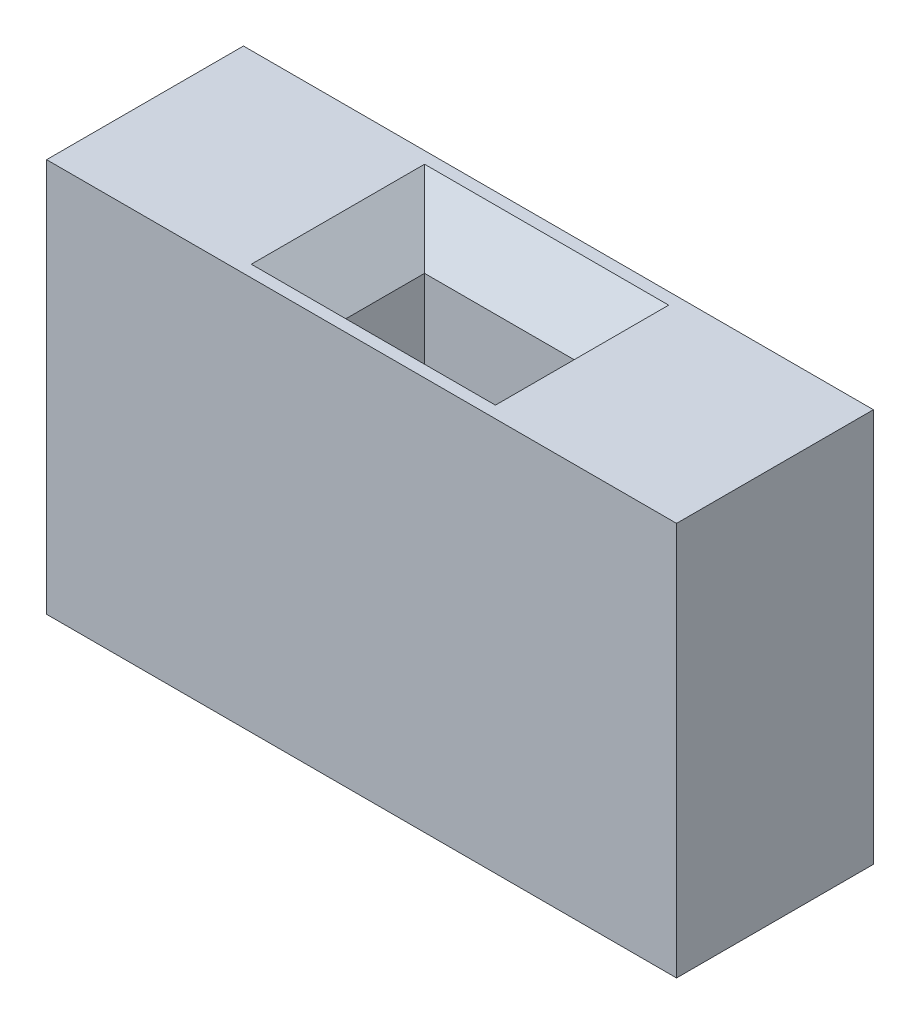
ISO-10303-21;
HEADER;
FILE_DESCRIPTION(('STEP AP214'),'2;1');
FILE_NAME('part.step','',(''),(''),'','','');
FILE_SCHEMA(('AUTOMOTIVE_DESIGN { 1 0 10303 214 1 1 1 1 }'));
ENDSEC;
DATA;
#1=APPLICATION_CONTEXT('core data for automotive mechanical design processes');
#2=APPLICATION_PROTOCOL_DEFINITION('international standard','automotive_design',2000,#1);
#3=PRODUCT_CONTEXT('',#1,'mechanical');
#4=PRODUCT('Part','Part','',(#3));
#5=PRODUCT_RELATED_PRODUCT_CATEGORY('part','',(#4));
#6=PRODUCT_DEFINITION_FORMATION('','',#4);
#7=PRODUCT_DEFINITION_CONTEXT('part definition',#1,'design');
#8=PRODUCT_DEFINITION('design','',#6,#7);
#9=PRODUCT_DEFINITION_SHAPE('','',#8);
#10=(LENGTH_UNIT() NAMED_UNIT(*) SI_UNIT(.MILLI.,.METRE.));
#11=(NAMED_UNIT(*) PLANE_ANGLE_UNIT() SI_UNIT($,.RADIAN.));
#12=(NAMED_UNIT(*) SI_UNIT($,.STERADIAN.) SOLID_ANGLE_UNIT());
#13=UNCERTAINTY_MEASURE_WITH_UNIT(LENGTH_MEASURE(1.E-05),#10,'distance_accuracy_value','');
#14=(GEOMETRIC_REPRESENTATION_CONTEXT(3) GLOBAL_UNCERTAINTY_ASSIGNED_CONTEXT((#13)) GLOBAL_UNIT_ASSIGNED_CONTEXT((#10,
#11,#12)) REPRESENTATION_CONTEXT('',''));
#15=CARTESIAN_POINT('',(0.,0.,0.));
#16=DIRECTION('',(0.,0.,1.));
#17=DIRECTION('',(1.,0.,0.));
#18=AXIS2_PLACEMENT_3D('',#15,#16,#17);
#19=CARTESIAN_POINT('',(-0.0400000000000042,0.025,0.0125000000000021));
#20=DIRECTION('',(0.,0.,-1.));
#21=DIRECTION('',(-1.,0.,0.));
#22=AXIS2_PLACEMENT_3D('',#19,#20,#21);
#23=PLANE('',#22);
#24=DIRECTION('',(1.,0.,0.));
#25=VECTOR('',#24,1.);
#26=CARTESIAN_POINT('',(-0.0400000000000042,-0.025,0.0125000000000021));
#27=LINE('',#26,#25);
#28=CARTESIAN_POINT('',(-0.0400000000000042,-0.025,0.0125000000000021));
#29=VERTEX_POINT('',#28);
#30=CARTESIAN_POINT('',(0.0399999999999958,-0.025,0.0125000000000021));
#31=VERTEX_POINT('',#30);
#32=EDGE_CURVE('E143',#29,#31,#27,.T.);
#33=ORIENTED_EDGE('',*,*,#32,.T.);
#34=DIRECTION('',(0.,-1.,0.));
#35=VECTOR('',#34,1.);
#36=CARTESIAN_POINT('',(0.0399999999999958,0.025,0.0125000000000021));
#37=LINE('',#36,#35);
#38=CARTESIAN_POINT('',(0.0399999999999958,0.025,0.0125000000000021));
#39=VERTEX_POINT('',#38);
#40=EDGE_CURVE('E175',#39,#31,#37,.T.);
#41=ORIENTED_EDGE('',*,*,#40,.F.);
#42=DIRECTION('',(1.,0.,0.));
#43=VECTOR('',#42,1.);
#44=CARTESIAN_POINT('',(-0.0400000000000042,0.025,0.0125000000000021));
#45=LINE('',#44,#43);
#46=CARTESIAN_POINT('',(-0.0400000000000042,0.025,0.0125000000000021));
#47=VERTEX_POINT('',#46);
#48=EDGE_CURVE('E147',#47,#39,#45,.T.);
#49=ORIENTED_EDGE('',*,*,#48,.F.);
#50=DIRECTION('',(0.,-1.,0.));
#51=VECTOR('',#50,1.);
#52=CARTESIAN_POINT('',(-0.0400000000000042,0.025,0.0125000000000021));
#53=LINE('',#52,#51);
#54=EDGE_CURVE('E159',#47,#29,#53,.T.);
#55=ORIENTED_EDGE('',*,*,#54,.T.);
#56=EDGE_LOOP('',(#33,#41,#49,#55));
#57=FACE_BOUND('',#56,.T.);
#58=ADVANCED_FACE('F35',(#57),#23,.F.);
#59=CARTESIAN_POINT('',(0.0399999999999958,0.025,0.0125000000000021));
#60=DIRECTION('',(-1.,0.,0.));
#61=DIRECTION('',(0.,0.,1.));
#62=AXIS2_PLACEMENT_3D('',#59,#60,#61);
#63=PLANE('',#62);
#64=DIRECTION('',(0.,0.,-1.));
#65=VECTOR('',#64,1.);
#66=CARTESIAN_POINT('',(0.0399999999999958,-0.025,0.0125000000000021));
#67=LINE('',#66,#65);
#68=CARTESIAN_POINT('',(0.0399999999999958,-0.025,-0.0124999999999986));
#69=VERTEX_POINT('',#68);
#70=EDGE_CURVE('E162',#31,#69,#67,.T.);
#71=ORIENTED_EDGE('',*,*,#70,.T.);
#72=DIRECTION('',(0.,-1.,0.));
#73=VECTOR('',#72,1.);
#74=CARTESIAN_POINT('',(0.0399999999999958,0.025,-0.0124999999999986));
#75=LINE('',#74,#73);
#76=CARTESIAN_POINT('',(0.0399999999999958,0.025,-0.0124999999999986));
#77=VERTEX_POINT('',#76);
#78=EDGE_CURVE('E173',#77,#69,#75,.T.);
#79=ORIENTED_EDGE('',*,*,#78,.F.);
#80=DIRECTION('',(0.,0.,-1.));
#81=VECTOR('',#80,1.);
#82=CARTESIAN_POINT('',(0.0399999999999958,0.025,0.0125000000000021));
#83=LINE('',#82,#81);
#84=EDGE_CURVE('E150',#39,#77,#83,.T.);
#85=ORIENTED_EDGE('',*,*,#84,.F.);
#86=ORIENTED_EDGE('',*,*,#40,.T.);
#87=EDGE_LOOP('',(#71,#79,#85,#86));
#88=FACE_BOUND('',#87,.T.);
#89=ADVANCED_FACE('F220',(#88),#63,.F.);
#90=CARTESIAN_POINT('',(-0.0400000000000042,0.025,-0.0124999999999986));
#91=DIRECTION('',(0.,0.,-1.));
#92=DIRECTION('',(-1.,0.,0.));
#93=AXIS2_PLACEMENT_3D('',#90,#91,#92);
#94=PLANE('',#93);
#95=DIRECTION('',(1.,0.,0.));
#96=VECTOR('',#95,1.);
#97=CARTESIAN_POINT('',(-0.0400000000000042,-0.025,-0.0124999999999986));
#98=LINE('',#97,#96);
#99=CARTESIAN_POINT('',(-0.0400000000000042,-0.025,-0.0124999999999986));
#100=VERTEX_POINT('',#99);
#101=EDGE_CURVE('E165',#100,#69,#98,.T.);
#102=ORIENTED_EDGE('',*,*,#101,.F.);
#103=DIRECTION('',(0.,-1.,0.));
#104=VECTOR('',#103,1.);
#105=CARTESIAN_POINT('',(-0.0400000000000042,0.025,-0.0124999999999986));
#106=LINE('',#105,#104);
#107=CARTESIAN_POINT('',(-0.0400000000000042,0.025,-0.0124999999999986));
#108=VERTEX_POINT('',#107);
#109=EDGE_CURVE('E171',#108,#100,#106,.T.);
#110=ORIENTED_EDGE('',*,*,#109,.F.);
#111=DIRECTION('',(1.,0.,0.));
#112=VECTOR('',#111,1.);
#113=CARTESIAN_POINT('',(-0.0400000000000042,0.025,-0.0124999999999986));
#114=LINE('',#113,#112);
#115=EDGE_CURVE('E153',#108,#77,#114,.T.);
#116=ORIENTED_EDGE('',*,*,#115,.T.);
#117=ORIENTED_EDGE('',*,*,#78,.T.);
#118=EDGE_LOOP('',(#102,#110,#116,#117));
#119=FACE_BOUND('',#118,.T.);
#120=ADVANCED_FACE('F226',(#119),#94,.T.);
#121=CARTESIAN_POINT('',(-0.0400000000000042,0.025,0.0125000000000021));
#122=DIRECTION('',(-1.,0.,0.));
#123=DIRECTION('',(0.,0.,1.));
#124=AXIS2_PLACEMENT_3D('',#121,#122,#123);
#125=PLANE('',#124);
#126=DIRECTION('',(0.,0.,-1.));
#127=VECTOR('',#126,1.);
#128=CARTESIAN_POINT('',(-0.0400000000000042,-0.025,0.0125000000000021));
#129=LINE('',#128,#127);
#130=EDGE_CURVE('E151',#29,#100,#129,.T.);
#131=ORIENTED_EDGE('',*,*,#130,.F.);
#132=ORIENTED_EDGE('',*,*,#54,.F.);
#133=DIRECTION('',(0.,0.,-1.));
#134=VECTOR('',#133,1.);
#135=CARTESIAN_POINT('',(-0.0400000000000042,0.025,0.0125000000000021));
#136=LINE('',#135,#134);
#137=EDGE_CURVE('E156',#47,#108,#136,.T.);
#138=ORIENTED_EDGE('',*,*,#137,.T.);
#139=ORIENTED_EDGE('',*,*,#109,.T.);
#140=EDGE_LOOP('',(#131,#132,#138,#139));
#141=FACE_BOUND('',#140,.T.);
#142=ADVANCED_FACE('F312',(#141),#125,.T.);
#143=CARTESIAN_POINT('',(0.,0.025,0.));
#144=DIRECTION('',(0.,1.,0.));
#145=DIRECTION('',(0.,0.,1.));
#146=AXIS2_PLACEMENT_3D('',#143,#144,#145);
#147=PLANE('',#146);
#148=DIRECTION('',(1.,0.,0.));
#149=VECTOR('',#148,1.);
#150=CARTESIAN_POINT('',(0.0095,0.025,-0.011));
#151=LINE('',#150,#149);
#152=CARTESIAN_POINT('',(-0.0155,0.025,-0.011));
#153=VERTEX_POINT('',#152);
#154=CARTESIAN_POINT('',(0.0155,0.025,-0.011));
#155=VERTEX_POINT('',#154);
#156=EDGE_CURVE('E179',#153,#155,#151,.T.);
#157=ORIENTED_EDGE('',*,*,#156,.T.);
#158=DIRECTION('',(0.,0.,1.));
#159=VECTOR('',#158,1.);
#160=CARTESIAN_POINT('',(0.0155,0.025,0.005));
#161=LINE('',#160,#159);
#162=CARTESIAN_POINT('',(0.0155,0.025,0.011));
#163=VERTEX_POINT('',#162);
#164=EDGE_CURVE('E185',#155,#163,#161,.T.);
#165=ORIENTED_EDGE('',*,*,#164,.T.);
#166=DIRECTION('',(-1.,0.,0.));
#167=VECTOR('',#166,1.);
#168=CARTESIAN_POINT('',(-0.0095,0.025,0.011));
#169=LINE('',#168,#167);
#170=CARTESIAN_POINT('',(-0.0155,0.025,0.011));
#171=VERTEX_POINT('',#170);
#172=EDGE_CURVE('E183',#163,#171,#169,.T.);
#173=ORIENTED_EDGE('',*,*,#172,.T.);
#174=DIRECTION('',(0.,0.,-1.));
#175=VECTOR('',#174,1.);
#176=CARTESIAN_POINT('',(-0.0155,0.025,-0.005));
#177=LINE('',#176,#175);
#178=EDGE_CURVE('E181',#171,#153,#177,.T.);
#179=ORIENTED_EDGE('',*,*,#178,.T.);
#180=EDGE_LOOP('',(#157,#165,#173,#179));
#181=FACE_BOUND('',#180,.T.);
#182=ORIENTED_EDGE('',*,*,#48,.T.);
#183=ORIENTED_EDGE('',*,*,#84,.T.);
#184=ORIENTED_EDGE('',*,*,#115,.F.);
#185=ORIENTED_EDGE('',*,*,#137,.F.);
#186=EDGE_LOOP('',(#182,#183,#184,#185));
#187=FACE_BOUND('',#186,.T.);
#188=ADVANCED_FACE('F308',(#181,#187),#147,.T.);
#189=CARTESIAN_POINT('',(0.,-0.025,0.));
#190=DIRECTION('',(0.,1.,0.));
#191=DIRECTION('',(0.,0.,1.));
#192=AXIS2_PLACEMENT_3D('',#189,#190,#191);
#193=PLANE('',#192);
#194=ORIENTED_EDGE('',*,*,#32,.F.);
#195=ORIENTED_EDGE('',*,*,#130,.T.);
#196=ORIENTED_EDGE('',*,*,#101,.T.);
#197=ORIENTED_EDGE('',*,*,#70,.F.);
#198=EDGE_LOOP('',(#194,#195,#196,#197));
#199=FACE_BOUND('',#198,.T.);
#200=ADVANCED_FACE('F301',(#199),#193,.F.);
#201=CARTESIAN_POINT('',(0.0095,-0.015,0.005));
#202=DIRECTION('',(1.,0.,0.));
#203=DIRECTION('',(0.,0.,-1.));
#204=AXIS2_PLACEMENT_3D('',#201,#202,#203);
#205=PLANE('',#204);
#206=DIRECTION('',(0.,1.,0.));
#207=VECTOR('',#206,1.);
#208=CARTESIAN_POINT('',(0.0095,-0.015,0.005));
#209=LINE('',#208,#207);
#210=CARTESIAN_POINT('',(0.0095,-0.015,0.005));
#211=VERTEX_POINT('',#210);
#212=CARTESIAN_POINT('',(0.0095,0.019,0.005));
#213=VERTEX_POINT('',#212);
#214=EDGE_CURVE('E141',#211,#213,#209,.T.);
#215=ORIENTED_EDGE('',*,*,#214,.T.);
#216=DIRECTION('',(0.,0.,-1.));
#217=VECTOR('',#216,1.);
#218=CARTESIAN_POINT('',(0.0095,0.019,-0.005));
#219=LINE('',#218,#217);
#220=CARTESIAN_POINT('',(0.0095,0.019,-0.005));
#221=VERTEX_POINT('',#220);
#222=EDGE_CURVE('E121',#213,#221,#219,.T.);
#223=ORIENTED_EDGE('',*,*,#222,.T.);
#224=DIRECTION('',(0.,1.,0.));
#225=VECTOR('',#224,1.);
#226=CARTESIAN_POINT('',(0.0095,-0.015,-0.005));
#227=LINE('',#226,#225);
#228=CARTESIAN_POINT('',(0.0095,-0.015,-0.005));
#229=VERTEX_POINT('',#228);
#230=EDGE_CURVE('E113',#229,#221,#227,.T.);
#231=ORIENTED_EDGE('',*,*,#230,.F.);
#232=DIRECTION('',(0.,0.,-1.));
#233=VECTOR('',#232,1.);
#234=CARTESIAN_POINT('',(0.0095,-0.015,0.005));
#235=LINE('',#234,#233);
#236=EDGE_CURVE('E118',#211,#229,#235,.T.);
#237=ORIENTED_EDGE('',*,*,#236,.F.);
#238=EDGE_LOOP('',(#215,#223,#231,#237));
#239=FACE_BOUND('',#238,.T.);
#240=ADVANCED_FACE('F116',(#239),#205,.F.);
#241=CARTESIAN_POINT('',(-0.0095,-0.015,0.005));
#242=DIRECTION('',(0.,0.,1.));
#243=DIRECTION('',(1.,0.,0.));
#244=AXIS2_PLACEMENT_3D('',#241,#242,#243);
#245=PLANE('',#244);
#246=DIRECTION('',(0.,1.,0.));
#247=VECTOR('',#246,1.);
#248=CARTESIAN_POINT('',(-0.0095,-0.015,0.005));
#249=LINE('',#248,#247);
#250=CARTESIAN_POINT('',(-0.0095,-0.015,0.005));
#251=VERTEX_POINT('',#250);
#252=CARTESIAN_POINT('',(-0.0095,0.019,0.005));
#253=VERTEX_POINT('',#252);
#254=EDGE_CURVE('E144',#251,#253,#249,.T.);
#255=ORIENTED_EDGE('',*,*,#254,.T.);
#256=DIRECTION('',(1.,0.,0.));
#257=VECTOR('',#256,1.);
#258=CARTESIAN_POINT('',(0.0095,0.019,0.005));
#259=LINE('',#258,#257);
#260=EDGE_CURVE('E188',#253,#213,#259,.T.);
#261=ORIENTED_EDGE('',*,*,#260,.T.);
#262=ORIENTED_EDGE('',*,*,#214,.F.);
#263=DIRECTION('',(1.,0.,0.));
#264=VECTOR('',#263,1.);
#265=CARTESIAN_POINT('',(-0.0095,-0.015,0.005));
#266=LINE('',#265,#264);
#267=EDGE_CURVE('E123',#251,#211,#266,.T.);
#268=ORIENTED_EDGE('',*,*,#267,.F.);
#269=EDGE_LOOP('',(#255,#261,#262,#268));
#270=FACE_BOUND('',#269,.T.);
#271=ADVANCED_FACE('F209',(#270),#245,.F.);
#272=CARTESIAN_POINT('',(-0.0095,-0.015,0.005));
#273=DIRECTION('',(-1.,0.,0.));
#274=DIRECTION('',(0.,0.,1.));
#275=AXIS2_PLACEMENT_3D('',#272,#273,#274);
#276=PLANE('',#275);
#277=DIRECTION('',(0.,1.,0.));
#278=VECTOR('',#277,1.);
#279=CARTESIAN_POINT('',(-0.0095,-0.015,-0.005));
#280=LINE('',#279,#278);
#281=CARTESIAN_POINT('',(-0.0095,-0.015,-0.005));
#282=VERTEX_POINT('',#281);
#283=CARTESIAN_POINT('',(-0.0095,0.019,-0.005));
#284=VERTEX_POINT('',#283);
#285=EDGE_CURVE('E122',#282,#284,#280,.T.);
#286=ORIENTED_EDGE('',*,*,#285,.T.);
#287=DIRECTION('',(0.,0.,1.));
#288=VECTOR('',#287,1.);
#289=CARTESIAN_POINT('',(-0.0095,0.019,0.005));
#290=LINE('',#289,#288);
#291=EDGE_CURVE('E45',#284,#253,#290,.T.);
#292=ORIENTED_EDGE('',*,*,#291,.T.);
#293=ORIENTED_EDGE('',*,*,#254,.F.);
#294=DIRECTION('',(0.,0.,1.));
#295=VECTOR('',#294,1.);
#296=CARTESIAN_POINT('',(-0.0095,-0.015,0.005));
#297=LINE('',#296,#295);
#298=EDGE_CURVE('E131',#282,#251,#297,.T.);
#299=ORIENTED_EDGE('',*,*,#298,.F.);
#300=EDGE_LOOP('',(#286,#292,#293,#299));
#301=FACE_BOUND('',#300,.T.);
#302=ADVANCED_FACE('F210',(#301),#276,.F.);
#303=CARTESIAN_POINT('',(-0.0095,-0.015,-0.005));
#304=DIRECTION('',(0.,0.,-1.));
#305=DIRECTION('',(-1.,0.,0.));
#306=AXIS2_PLACEMENT_3D('',#303,#304,#305);
#307=PLANE('',#306);
#308=ORIENTED_EDGE('',*,*,#230,.T.);
#309=DIRECTION('',(-1.,0.,0.));
#310=VECTOR('',#309,1.);
#311=CARTESIAN_POINT('',(-0.0095,0.019,-0.005));
#312=LINE('',#311,#310);
#313=EDGE_CURVE('E11',#221,#284,#312,.T.);
#314=ORIENTED_EDGE('',*,*,#313,.T.);
#315=ORIENTED_EDGE('',*,*,#285,.F.);
#316=DIRECTION('',(-1.,0.,0.));
#317=VECTOR('',#316,1.);
#318=CARTESIAN_POINT('',(-0.0095,-0.015,-0.005));
#319=LINE('',#318,#317);
#320=EDGE_CURVE('E126',#229,#282,#319,.T.);
#321=ORIENTED_EDGE('',*,*,#320,.F.);
#322=EDGE_LOOP('',(#308,#314,#315,#321));
#323=FACE_BOUND('',#322,.T.);
#324=ADVANCED_FACE('F127',(#323),#307,.F.);
#325=CARTESIAN_POINT('',(0.,-0.015,0.));
#326=DIRECTION('',(0.,-1.,0.));
#327=DIRECTION('',(0.,0.,-1.));
#328=AXIS2_PLACEMENT_3D('',#325,#326,#327);
#329=PLANE('',#328);
#330=ORIENTED_EDGE('',*,*,#236,.T.);
#331=ORIENTED_EDGE('',*,*,#320,.T.);
#332=ORIENTED_EDGE('',*,*,#298,.T.);
#333=ORIENTED_EDGE('',*,*,#267,.T.);
#334=EDGE_LOOP('',(#330,#331,#332,#333));
#335=FACE_BOUND('',#334,.T.);
#336=ADVANCED_FACE('F133',(#335),#329,.F.);
#337=CARTESIAN_POINT('',(-0.0095,0.019,0.005));
#338=DIRECTION('',(0.707106781186546,0.707106781186549,0.));
#339=DIRECTION('',(0.,0.,-1.));
#340=AXIS2_PLACEMENT_3D('',#337,#338,#339);
#341=PLANE('',#340);
#342=DIRECTION('',(0.577350269189627,-0.577350269189624,0.577350269189627));
#343=VECTOR('',#342,1.);
#344=CARTESIAN_POINT('',(-0.00616666666666666,0.0156666666666667,-0.00166666666666666));
#345=LINE('',#344,#343);
#346=EDGE_CURVE('E137',#153,#284,#345,.T.);
#347=ORIENTED_EDGE('',*,*,#346,.F.);
#348=ORIENTED_EDGE('',*,*,#178,.F.);
#349=DIRECTION('',(0.577350269189627,-0.577350269189624,-0.577350269189627));
#350=VECTOR('',#349,1.);
#351=CARTESIAN_POINT('',(-0.0095,0.019,0.005));
#352=LINE('',#351,#350);
#353=EDGE_CURVE('E40',#253,#171,#352,.F.);
#354=ORIENTED_EDGE('',*,*,#353,.F.);
#355=ORIENTED_EDGE('',*,*,#291,.F.);
#356=EDGE_LOOP('',(#347,#348,#354,#355));
#357=FACE_BOUND('',#356,.T.);
#358=ADVANCED_FACE('F38',(#357),#341,.T.);
#359=CARTESIAN_POINT('',(-0.0095,0.019,0.005));
#360=DIRECTION('',(0.,0.707106781186549,-0.707106781186546));
#361=DIRECTION('',(-1.,0.,0.));
#362=AXIS2_PLACEMENT_3D('',#359,#360,#361);
#363=PLANE('',#362);
#364=ORIENTED_EDGE('',*,*,#353,.T.);
#365=ORIENTED_EDGE('',*,*,#172,.F.);
#366=DIRECTION('',(-0.577350269189627,-0.577350269189624,-0.577350269189626));
#367=VECTOR('',#366,1.);
#368=CARTESIAN_POINT('',(0.0095,0.019,0.005));
#369=LINE('',#368,#367);
#370=EDGE_CURVE('E193',#213,#163,#369,.F.);
#371=ORIENTED_EDGE('',*,*,#370,.F.);
#372=ORIENTED_EDGE('',*,*,#260,.F.);
#373=EDGE_LOOP('',(#364,#365,#371,#372));
#374=FACE_BOUND('',#373,.T.);
#375=ADVANCED_FACE('F207',(#374),#363,.T.);
#376=CARTESIAN_POINT('',(-0.0095,0.019,-0.005));
#377=DIRECTION('',(0.,0.707106781186549,0.707106781186546));
#378=DIRECTION('',(1.,0.,0.));
#379=AXIS2_PLACEMENT_3D('',#376,#377,#378);
#380=PLANE('',#379);
#381=ORIENTED_EDGE('',*,*,#346,.T.);
#382=ORIENTED_EDGE('',*,*,#313,.F.);
#383=DIRECTION('',(0.577350269189627,0.577350269189624,-0.577350269189626));
#384=VECTOR('',#383,1.);
#385=CARTESIAN_POINT('',(0.00616666666666666,0.0156666666666667,-0.00166666666666666));
#386=LINE('',#385,#384);
#387=EDGE_CURVE('E191',#155,#221,#386,.F.);
#388=ORIENTED_EDGE('',*,*,#387,.F.);
#389=ORIENTED_EDGE('',*,*,#156,.F.);
#390=EDGE_LOOP('',(#381,#382,#388,#389));
#391=FACE_BOUND('',#390,.T.);
#392=ADVANCED_FACE('F198',(#391),#380,.T.);
#393=CARTESIAN_POINT('',(0.0095,0.019,0.005));
#394=DIRECTION('',(-0.707106781186546,0.707106781186549,0.));
#395=DIRECTION('',(0.,0.,1.));
#396=AXIS2_PLACEMENT_3D('',#393,#394,#395);
#397=PLANE('',#396);
#398=ORIENTED_EDGE('',*,*,#370,.T.);
#399=ORIENTED_EDGE('',*,*,#164,.F.);
#400=ORIENTED_EDGE('',*,*,#387,.T.);
#401=ORIENTED_EDGE('',*,*,#222,.F.);
#402=EDGE_LOOP('',(#398,#399,#400,#401));
#403=FACE_BOUND('',#402,.T.);
#404=ADVANCED_FACE('F232',(#403),#397,.T.);
#405=CLOSED_SHELL('',(#58,#89,#120,#142,#188,#200,#240,#271,#302,#324,#336,#358,#375,#392,#404));
#406=MANIFOLD_SOLID_BREP('B2',#405);
#407=ADVANCED_BREP_SHAPE_REPRESENTATION('',(#18,#406),#14);
#408=SHAPE_DEFINITION_REPRESENTATION(#9,#407);
ENDSEC;
END-ISO-10303-21;
